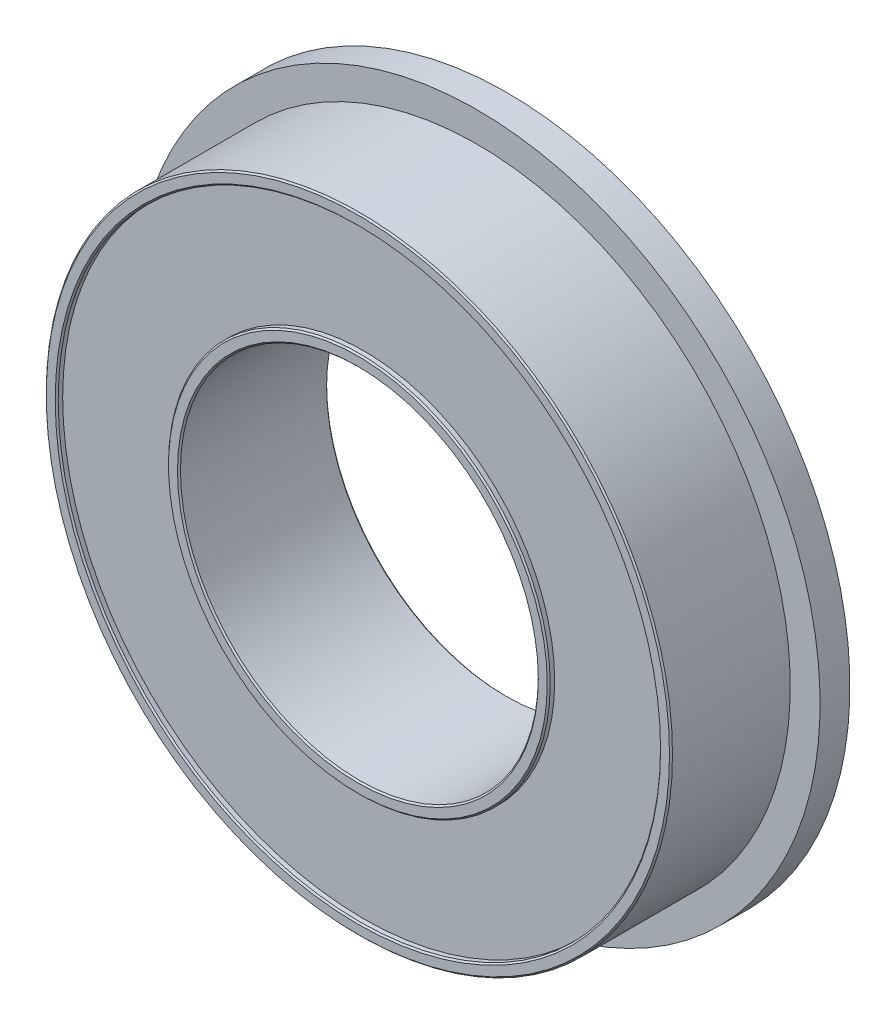
ISO-10303-21;
HEADER;
FILE_DESCRIPTION(('STEP AP214'),'2;1');
FILE_NAME('part.step','',(''),(''),'','','');
FILE_SCHEMA(('AUTOMOTIVE_DESIGN { 1 0 10303 214 1 1 1 1 }'));
ENDSEC;
DATA;
#1=APPLICATION_CONTEXT('core data for automotive mechanical design processes');
#2=APPLICATION_PROTOCOL_DEFINITION('international standard','automotive_design',2000,#1);
#3=PRODUCT_CONTEXT('',#1,'mechanical');
#4=PRODUCT('Part','Part','',(#3));
#5=PRODUCT_RELATED_PRODUCT_CATEGORY('part','',(#4));
#6=PRODUCT_DEFINITION_FORMATION('','',#4);
#7=PRODUCT_DEFINITION_CONTEXT('part definition',#1,'design');
#8=PRODUCT_DEFINITION('design','',#6,#7);
#9=PRODUCT_DEFINITION_SHAPE('','',#8);
#10=(LENGTH_UNIT() NAMED_UNIT(*) SI_UNIT(.MILLI.,.METRE.));
#11=(NAMED_UNIT(*) PLANE_ANGLE_UNIT() SI_UNIT($,.RADIAN.));
#12=(NAMED_UNIT(*) SI_UNIT($,.STERADIAN.) SOLID_ANGLE_UNIT());
#13=UNCERTAINTY_MEASURE_WITH_UNIT(LENGTH_MEASURE(1.E-05),#10,'distance_accuracy_value','');
#14=(GEOMETRIC_REPRESENTATION_CONTEXT(3) GLOBAL_UNCERTAINTY_ASSIGNED_CONTEXT((#13)) GLOBAL_UNIT_ASSIGNED_CONTEXT((#10,
#11,#12)) REPRESENTATION_CONTEXT('',''));
#15=CARTESIAN_POINT('',(0.,0.,0.));
#16=DIRECTION('',(0.,0.,1.));
#17=DIRECTION('',(1.,0.,0.));
#18=AXIS2_PLACEMENT_3D('',#15,#16,#17);
#19=CARTESIAN_POINT('',(0.,0.,-2.5));
#20=DIRECTION('',(0.,0.,1.));
#21=DIRECTION('',(1.,0.,0.));
#22=AXIS2_PLACEMENT_3D('',#19,#20,#21);
#23=PLANE('',#22);
#24=CARTESIAN_POINT('',(0.,0.,-2.5));
#25=DIRECTION('',(0.,0.,1.));
#26=DIRECTION('',(1.,0.,0.));
#27=AXIS2_PLACEMENT_3D('',#24,#25,#26);
#28=CIRCLE('',#27,10.15);
#29=CARTESIAN_POINT('',(10.15,0.,-2.5));
#30=VERTEX_POINT('',#29);
#31=EDGE_CURVE('E39',#30,#30,#28,.T.);
#32=ORIENTED_EDGE('',*,*,#31,.T.);
#33=EDGE_LOOP('',(#32));
#34=FACE_BOUND('',#33,.T.);
#35=CARTESIAN_POINT('',(0.,0.,-2.5));
#36=DIRECTION('',(0.,0.,-1.));
#37=DIRECTION('',(-1.,0.,0.));
#38=AXIS2_PLACEMENT_3D('',#35,#36,#37);
#39=CIRCLE('',#38,11.5);
#40=CARTESIAN_POINT('',(-11.5,0.,-2.5));
#41=VERTEX_POINT('',#40);
#42=EDGE_CURVE('E86',#41,#41,#39,.T.);
#43=ORIENTED_EDGE('',*,*,#42,.T.);
#44=EDGE_LOOP('',(#43));
#45=FACE_BOUND('',#44,.T.);
#46=ADVANCED_FACE('F32',(#34,#45),#23,.F.);
#47=CARTESIAN_POINT('',(0.,0.,2.5));
#48=DIRECTION('',(0.,0.,1.));
#49=DIRECTION('',(1.,0.,0.));
#50=AXIS2_PLACEMENT_3D('',#47,#48,#49);
#51=PLANE('',#50);
#52=CARTESIAN_POINT('',(0.,0.,2.5));
#53=DIRECTION('',(0.,0.,1.));
#54=DIRECTION('',(1.,0.,0.));
#55=AXIS2_PLACEMENT_3D('',#52,#53,#54);
#56=CIRCLE('',#55,6.35);
#57=CARTESIAN_POINT('',(6.35,0.,2.5));
#58=VERTEX_POINT('',#57);
#59=EDGE_CURVE('E61',#58,#58,#56,.T.);
#60=ORIENTED_EDGE('',*,*,#59,.T.);
#61=EDGE_LOOP('',(#60));
#62=FACE_BOUND('',#61,.T.);
#63=CARTESIAN_POINT('',(0.,0.,2.5));
#64=DIRECTION('',(0.,0.,1.));
#65=DIRECTION('',(1.,0.,0.));
#66=AXIS2_PLACEMENT_3D('',#63,#64,#65);
#67=CIRCLE('',#66,6.05);
#68=CARTESIAN_POINT('',(6.05,0.,2.5));
#69=VERTEX_POINT('',#68);
#70=EDGE_CURVE('E64',#69,#69,#67,.F.);
#71=ORIENTED_EDGE('',*,*,#70,.T.);
#72=EDGE_LOOP('',(#71));
#73=FACE_BOUND('',#72,.T.);
#74=ADVANCED_FACE('F122',(#62,#73),#51,.T.);
#75=CARTESIAN_POINT('',(0.,0.,2.5));
#76=DIRECTION('',(0.,0.,-1.));
#77=DIRECTION('',(-1.,0.,0.));
#78=AXIS2_PLACEMENT_3D('',#75,#76,#77);
#79=CYLINDRICAL_SURFACE('',#78,10.5);
#80=CARTESIAN_POINT('',(0.,0.,2.45));
#81=DIRECTION('',(0.,0.,1.));
#82=DIRECTION('',(1.,0.,0.));
#83=AXIS2_PLACEMENT_3D('',#80,#81,#82);
#84=CIRCLE('',#83,10.5);
#85=CARTESIAN_POINT('',(10.5,0.,2.45));
#86=VERTEX_POINT('',#85);
#87=EDGE_CURVE('E47',#86,#86,#84,.F.);
#88=ORIENTED_EDGE('',*,*,#87,.T.);
#89=EDGE_LOOP('',(#88));
#90=FACE_BOUND('',#89,.T.);
#91=CARTESIAN_POINT('',(0.,0.,-1.5));
#92=DIRECTION('',(0.,0.,-1.));
#93=DIRECTION('',(-1.,0.,0.));
#94=AXIS2_PLACEMENT_3D('',#91,#92,#93);
#95=CIRCLE('',#94,10.5);
#96=CARTESIAN_POINT('',(-10.5,0.,-1.5));
#97=VERTEX_POINT('',#96);
#98=EDGE_CURVE('E82',#97,#97,#95,.T.);
#99=ORIENTED_EDGE('',*,*,#98,.F.);
#100=EDGE_LOOP('',(#99));
#101=FACE_BOUND('',#100,.T.);
#102=ADVANCED_FACE('F128',(#90,#101),#79,.T.);
#103=CARTESIAN_POINT('',(0.,0.,2.5));
#104=DIRECTION('',(0.,0.,1.));
#105=DIRECTION('',(1.,0.,0.));
#106=AXIS2_PLACEMENT_3D('',#103,#104,#105);
#107=CIRCLE('',#106,10.45);
#108=CARTESIAN_POINT('',(10.45,0.,2.5));
#109=VERTEX_POINT('',#108);
#110=EDGE_CURVE('E52',#109,#109,#107,.T.);
#111=ORIENTED_EDGE('',*,*,#110,.T.);
#112=EDGE_LOOP('',(#111));
#113=FACE_BOUND('',#112,.T.);
#114=CARTESIAN_POINT('',(0.,0.,2.5));
#115=DIRECTION('',(0.,0.,1.));
#116=DIRECTION('',(1.,0.,0.));
#117=AXIS2_PLACEMENT_3D('',#114,#115,#116);
#118=CIRCLE('',#117,10.15);
#119=CARTESIAN_POINT('',(10.15,0.,2.5));
#120=VERTEX_POINT('',#119);
#121=EDGE_CURVE('E55',#120,#120,#118,.F.);
#122=ORIENTED_EDGE('',*,*,#121,.T.);
#123=EDGE_LOOP('',(#122));
#124=FACE_BOUND('',#123,.T.);
#125=ADVANCED_FACE('F131',(#113,#124),#51,.T.);
#126=CARTESIAN_POINT('',(0.,0.,-2.5));
#127=DIRECTION('',(0.,0.,1.));
#128=DIRECTION('',(1.,0.,0.));
#129=AXIS2_PLACEMENT_3D('',#126,#127,#128);
#130=CIRCLE('',#129,6.05);
#131=CARTESIAN_POINT('',(6.05,0.,-2.5));
#132=VERTEX_POINT('',#131);
#133=EDGE_CURVE('E76',#132,#132,#130,.T.);
#134=ORIENTED_EDGE('',*,*,#133,.T.);
#135=EDGE_LOOP('',(#134));
#136=FACE_BOUND('',#135,.T.);
#137=CARTESIAN_POINT('',(0.,0.,-2.5));
#138=DIRECTION('',(0.,0.,1.));
#139=DIRECTION('',(1.,0.,0.));
#140=AXIS2_PLACEMENT_3D('',#137,#138,#139);
#141=CIRCLE('',#140,6.35);
#142=CARTESIAN_POINT('',(6.35,0.,-2.5));
#143=VERTEX_POINT('',#142);
#144=EDGE_CURVE('E79',#143,#143,#141,.F.);
#145=ORIENTED_EDGE('',*,*,#144,.T.);
#146=EDGE_LOOP('',(#145));
#147=FACE_BOUND('',#146,.T.);
#148=ADVANCED_FACE('F124',(#136,#147),#23,.F.);
#149=CARTESIAN_POINT('',(0.,0.,2.5));
#150=DIRECTION('',(0.,0.,-1.));
#151=DIRECTION('',(-1.,0.,0.));
#152=AXIS2_PLACEMENT_3D('',#149,#150,#151);
#153=CYLINDRICAL_SURFACE('',#152,6.);
#154=CARTESIAN_POINT('',(0.,0.,-2.45));
#155=DIRECTION('',(0.,0.,1.));
#156=DIRECTION('',(1.,0.,0.));
#157=AXIS2_PLACEMENT_3D('',#154,#155,#156);
#158=CIRCLE('',#157,6.);
#159=CARTESIAN_POINT('',(6.,0.,-2.45));
#160=VERTEX_POINT('',#159);
#161=EDGE_CURVE('E70',#160,#160,#158,.F.);
#162=ORIENTED_EDGE('',*,*,#161,.T.);
#163=EDGE_LOOP('',(#162));
#164=FACE_BOUND('',#163,.T.);
#165=CARTESIAN_POINT('',(0.,0.,2.45));
#166=DIRECTION('',(0.,0.,1.));
#167=DIRECTION('',(1.,0.,0.));
#168=AXIS2_PLACEMENT_3D('',#165,#166,#167);
#169=CIRCLE('',#168,6.);
#170=CARTESIAN_POINT('',(6.,0.,2.45));
#171=VERTEX_POINT('',#170);
#172=EDGE_CURVE('E73',#171,#171,#169,.T.);
#173=ORIENTED_EDGE('',*,*,#172,.T.);
#174=EDGE_LOOP('',(#173));
#175=FACE_BOUND('',#174,.T.);
#176=ADVANCED_FACE('F135',(#164,#175),#153,.F.);
#177=CARTESIAN_POINT('',(0.,0.,-1.5));
#178=DIRECTION('',(0.,0.,-1.));
#179=DIRECTION('',(-1.,0.,0.));
#180=AXIS2_PLACEMENT_3D('',#177,#178,#179);
#181=PLANE('',#180);
#182=CARTESIAN_POINT('',(0.,0.,-1.5));
#183=DIRECTION('',(0.,0.,-1.));
#184=DIRECTION('',(-1.,0.,0.));
#185=AXIS2_PLACEMENT_3D('',#182,#183,#184);
#186=CIRCLE('',#185,11.5);
#187=CARTESIAN_POINT('',(-11.5,0.,-1.5));
#188=VERTEX_POINT('',#187);
#189=EDGE_CURVE('E85',#188,#188,#186,.T.);
#190=ORIENTED_EDGE('',*,*,#189,.F.);
#191=EDGE_LOOP('',(#190));
#192=FACE_BOUND('',#191,.T.);
#193=ORIENTED_EDGE('',*,*,#98,.T.);
#194=EDGE_LOOP('',(#193));
#195=FACE_BOUND('',#194,.T.);
#196=ADVANCED_FACE('F141',(#192,#195),#181,.F.);
#197=CARTESIAN_POINT('',(0.,0.,-1.5));
#198=DIRECTION('',(0.,0.,-1.));
#199=DIRECTION('',(-1.,0.,0.));
#200=AXIS2_PLACEMENT_3D('',#197,#198,#199);
#201=CYLINDRICAL_SURFACE('',#200,11.5);
#202=ORIENTED_EDGE('',*,*,#189,.T.);
#203=EDGE_LOOP('',(#202));
#204=FACE_BOUND('',#203,.T.);
#205=ORIENTED_EDGE('',*,*,#42,.F.);
#206=EDGE_LOOP('',(#205));
#207=FACE_BOUND('',#206,.T.);
#208=ADVANCED_FACE('F182',(#204,#207),#201,.T.);
#209=CARTESIAN_POINT('',(0.,0.,2.3));
#210=DIRECTION('',(0.,0.,1.));
#211=DIRECTION('',(1.,0.,0.));
#212=AXIS2_PLACEMENT_3D('',#209,#210,#211);
#213=CYLINDRICAL_SURFACE('',#212,10.1);
#214=CARTESIAN_POINT('',(0.,0.,2.45));
#215=DIRECTION('',(0.,0.,1.));
#216=DIRECTION('',(1.,0.,0.));
#217=AXIS2_PLACEMENT_3D('',#214,#215,#216);
#218=CIRCLE('',#217,10.1);
#219=CARTESIAN_POINT('',(10.1,0.,2.45));
#220=VERTEX_POINT('',#219);
#221=EDGE_CURVE('E43',#220,#220,#218,.T.);
#222=ORIENTED_EDGE('',*,*,#221,.T.);
#223=EDGE_LOOP('',(#222));
#224=FACE_BOUND('',#223,.T.);
#225=CARTESIAN_POINT('',(0.,0.,2.3));
#226=DIRECTION('',(0.,0.,1.));
#227=DIRECTION('',(1.,0.,0.));
#228=AXIS2_PLACEMENT_3D('',#225,#226,#227);
#229=CIRCLE('',#228,10.1);
#230=CARTESIAN_POINT('',(10.1,0.,2.3));
#231=VERTEX_POINT('',#230);
#232=EDGE_CURVE('E89',#231,#231,#229,.T.);
#233=ORIENTED_EDGE('',*,*,#232,.F.);
#234=EDGE_LOOP('',(#233));
#235=FACE_BOUND('',#234,.T.);
#236=ADVANCED_FACE('F178',(#224,#235),#213,.F.);
#237=CARTESIAN_POINT('',(0.,0.,2.3));
#238=DIRECTION('',(0.,0.,1.));
#239=DIRECTION('',(1.,0.,0.));
#240=AXIS2_PLACEMENT_3D('',#237,#238,#239);
#241=PLANE('',#240);
#242=CARTESIAN_POINT('',(0.,0.,2.3));
#243=DIRECTION('',(0.,0.,1.));
#244=DIRECTION('',(1.,0.,0.));
#245=AXIS2_PLACEMENT_3D('',#242,#243,#244);
#246=CIRCLE('',#245,6.4);
#247=CARTESIAN_POINT('',(6.4,0.,2.3));
#248=VERTEX_POINT('',#247);
#249=EDGE_CURVE('E94',#248,#248,#246,.T.);
#250=ORIENTED_EDGE('',*,*,#249,.F.);
#251=EDGE_LOOP('',(#250));
#252=FACE_BOUND('',#251,.T.);
#253=ORIENTED_EDGE('',*,*,#232,.T.);
#254=EDGE_LOOP('',(#253));
#255=FACE_BOUND('',#254,.T.);
#256=ADVANCED_FACE('F181',(#252,#255),#241,.T.);
#257=CARTESIAN_POINT('',(0.,0.,2.3));
#258=DIRECTION('',(0.,0.,1.));
#259=DIRECTION('',(1.,0.,0.));
#260=AXIS2_PLACEMENT_3D('',#257,#258,#259);
#261=CYLINDRICAL_SURFACE('',#260,6.4);
#262=CARTESIAN_POINT('',(0.,0.,2.45));
#263=DIRECTION('',(0.,0.,1.));
#264=DIRECTION('',(1.,0.,0.));
#265=AXIS2_PLACEMENT_3D('',#262,#263,#264);
#266=CIRCLE('',#265,6.4);
#267=CARTESIAN_POINT('',(6.4,0.,2.45));
#268=VERTEX_POINT('',#267);
#269=EDGE_CURVE('E58',#268,#268,#266,.F.);
#270=ORIENTED_EDGE('',*,*,#269,.T.);
#271=EDGE_LOOP('',(#270));
#272=FACE_BOUND('',#271,.T.);
#273=ORIENTED_EDGE('',*,*,#249,.T.);
#274=EDGE_LOOP('',(#273));
#275=FACE_BOUND('',#274,.T.);
#276=ADVANCED_FACE('F187',(#272,#275),#261,.T.);
#277=CARTESIAN_POINT('',(0.,0.,-2.3));
#278=DIRECTION('',(0.,0.,-1.));
#279=DIRECTION('',(1.,0.,0.));
#280=AXIS2_PLACEMENT_3D('',#277,#278,#279);
#281=PLANE('',#280);
#282=CARTESIAN_POINT('',(0.,0.,-2.3));
#283=DIRECTION('',(0.,0.,1.));
#284=DIRECTION('',(1.,0.,0.));
#285=AXIS2_PLACEMENT_3D('',#282,#283,#284);
#286=CIRCLE('',#285,10.1);
#287=CARTESIAN_POINT('',(10.1,0.,-2.3));
#288=VERTEX_POINT('',#287);
#289=EDGE_CURVE('E97',#288,#288,#286,.T.);
#290=ORIENTED_EDGE('',*,*,#289,.F.);
#291=EDGE_LOOP('',(#290));
#292=FACE_BOUND('',#291,.T.);
#293=CARTESIAN_POINT('',(0.,0.,-2.3));
#294=DIRECTION('',(0.,0.,1.));
#295=DIRECTION('',(1.,0.,0.));
#296=AXIS2_PLACEMENT_3D('',#293,#294,#295);
#297=CIRCLE('',#296,6.4);
#298=CARTESIAN_POINT('',(6.4,0.,-2.3));
#299=VERTEX_POINT('',#298);
#300=EDGE_CURVE('E100',#299,#299,#297,.T.);
#301=ORIENTED_EDGE('',*,*,#300,.T.);
#302=EDGE_LOOP('',(#301));
#303=FACE_BOUND('',#302,.T.);
#304=ADVANCED_FACE('F104',(#292,#303),#281,.T.);
#305=CARTESIAN_POINT('',(0.,0.,-2.3));
#306=DIRECTION('',(0.,0.,-1.));
#307=DIRECTION('',(-1.,0.,0.));
#308=AXIS2_PLACEMENT_3D('',#305,#306,#307);
#309=CYLINDRICAL_SURFACE('',#308,10.1);
#310=CARTESIAN_POINT('',(0.,0.,-2.45));
#311=DIRECTION('',(0.,0.,1.));
#312=DIRECTION('',(1.,0.,0.));
#313=AXIS2_PLACEMENT_3D('',#310,#311,#312);
#314=CIRCLE('',#313,10.1);
#315=CARTESIAN_POINT('',(10.1,0.,-2.45));
#316=VERTEX_POINT('',#315);
#317=EDGE_CURVE('E10',#316,#316,#314,.F.);
#318=ORIENTED_EDGE('',*,*,#317,.T.);
#319=EDGE_LOOP('',(#318));
#320=FACE_BOUND('',#319,.T.);
#321=ORIENTED_EDGE('',*,*,#289,.T.);
#322=EDGE_LOOP('',(#321));
#323=FACE_BOUND('',#322,.T.);
#324=ADVANCED_FACE('F109',(#320,#323),#309,.F.);
#325=CARTESIAN_POINT('',(0.,0.,-2.3));
#326=DIRECTION('',(0.,0.,-1.));
#327=DIRECTION('',(-1.,0.,0.));
#328=AXIS2_PLACEMENT_3D('',#325,#326,#327);
#329=CYLINDRICAL_SURFACE('',#328,6.4);
#330=CARTESIAN_POINT('',(0.,0.,-2.45));
#331=DIRECTION('',(0.,0.,1.));
#332=DIRECTION('',(1.,0.,0.));
#333=AXIS2_PLACEMENT_3D('',#330,#331,#332);
#334=CIRCLE('',#333,6.4);
#335=CARTESIAN_POINT('',(6.4,0.,-2.45));
#336=VERTEX_POINT('',#335);
#337=EDGE_CURVE('E67',#336,#336,#334,.T.);
#338=ORIENTED_EDGE('',*,*,#337,.T.);
#339=EDGE_LOOP('',(#338));
#340=FACE_BOUND('',#339,.T.);
#341=ORIENTED_EDGE('',*,*,#300,.F.);
#342=EDGE_LOOP('',(#341));
#343=FACE_BOUND('',#342,.T.);
#344=ADVANCED_FACE('F106',(#340,#343),#329,.T.);
#345=CARTESIAN_POINT('',(0.,0.,-2.5));
#346=DIRECTION('',(0.,0.,-1.));
#347=DIRECTION('',(-1.,0.,0.));
#348=AXIS2_PLACEMENT_3D('',#345,#346,#347);
#349=CONICAL_SURFACE('',#348,6.05,0.785398163397457);
#350=ORIENTED_EDGE('',*,*,#161,.F.);
#351=EDGE_LOOP('',(#350));
#352=FACE_BOUND('',#351,.T.);
#353=ORIENTED_EDGE('',*,*,#133,.F.);
#354=EDGE_LOOP('',(#353));
#355=FACE_BOUND('',#354,.T.);
#356=ADVANCED_FACE('F108',(#352,#355),#349,.F.);
#357=CARTESIAN_POINT('',(0.,0.,-2.45));
#358=DIRECTION('',(0.,0.,1.));
#359=DIRECTION('',(1.,0.,0.));
#360=AXIS2_PLACEMENT_3D('',#357,#358,#359);
#361=CONICAL_SURFACE('',#360,6.4,0.78539816339744);
#362=ORIENTED_EDGE('',*,*,#144,.F.);
#363=EDGE_LOOP('',(#362));
#364=FACE_BOUND('',#363,.T.);
#365=ORIENTED_EDGE('',*,*,#337,.F.);
#366=EDGE_LOOP('',(#365));
#367=FACE_BOUND('',#366,.T.);
#368=ADVANCED_FACE('F116',(#364,#367),#361,.T.);
#369=CARTESIAN_POINT('',(0.,0.,2.5));
#370=DIRECTION('',(0.,0.,-1.));
#371=DIRECTION('',(-1.,0.,0.));
#372=AXIS2_PLACEMENT_3D('',#369,#370,#371);
#373=CONICAL_SURFACE('',#372,6.35,0.785398163397466);
#374=ORIENTED_EDGE('',*,*,#269,.F.);
#375=EDGE_LOOP('',(#374));
#376=FACE_BOUND('',#375,.T.);
#377=ORIENTED_EDGE('',*,*,#59,.F.);
#378=EDGE_LOOP('',(#377));
#379=FACE_BOUND('',#378,.T.);
#380=ADVANCED_FACE('F151',(#376,#379),#373,.T.);
#381=CARTESIAN_POINT('',(0.,0.,2.45));
#382=DIRECTION('',(0.,0.,1.));
#383=DIRECTION('',(1.,0.,0.));
#384=AXIS2_PLACEMENT_3D('',#381,#382,#383);
#385=CONICAL_SURFACE('',#384,6.,0.785398163397431);
#386=ORIENTED_EDGE('',*,*,#70,.F.);
#387=EDGE_LOOP('',(#386));
#388=FACE_BOUND('',#387,.T.);
#389=ORIENTED_EDGE('',*,*,#172,.F.);
#390=EDGE_LOOP('',(#389));
#391=FACE_BOUND('',#390,.T.);
#392=ADVANCED_FACE('F157',(#388,#391),#385,.F.);
#393=CARTESIAN_POINT('',(0.,0.,2.5));
#394=DIRECTION('',(0.,0.,-1.));
#395=DIRECTION('',(-1.,0.,0.));
#396=AXIS2_PLACEMENT_3D('',#393,#394,#395);
#397=CONICAL_SURFACE('',#396,10.45,0.785398163397448);
#398=ORIENTED_EDGE('',*,*,#87,.F.);
#399=EDGE_LOOP('',(#398));
#400=FACE_BOUND('',#399,.T.);
#401=ORIENTED_EDGE('',*,*,#110,.F.);
#402=EDGE_LOOP('',(#401));
#403=FACE_BOUND('',#402,.T.);
#404=ADVANCED_FACE('F163',(#400,#403),#397,.T.);
#405=CARTESIAN_POINT('',(0.,0.,2.45));
#406=DIRECTION('',(0.,0.,1.));
#407=DIRECTION('',(1.,0.,0.));
#408=AXIS2_PLACEMENT_3D('',#405,#406,#407);
#409=CONICAL_SURFACE('',#408,10.1,0.785398163397414);
#410=ORIENTED_EDGE('',*,*,#121,.F.);
#411=EDGE_LOOP('',(#410));
#412=FACE_BOUND('',#411,.T.);
#413=ORIENTED_EDGE('',*,*,#221,.F.);
#414=EDGE_LOOP('',(#413));
#415=FACE_BOUND('',#414,.T.);
#416=ADVANCED_FACE('F166',(#412,#415),#409,.F.);
#417=CARTESIAN_POINT('',(0.,0.,-2.5));
#418=DIRECTION('',(0.,0.,-1.));
#419=DIRECTION('',(-1.,0.,0.));
#420=AXIS2_PLACEMENT_3D('',#417,#418,#419);
#421=CONICAL_SURFACE('',#420,10.15,0.785398163397448);
#422=ORIENTED_EDGE('',*,*,#317,.F.);
#423=EDGE_LOOP('',(#422));
#424=FACE_BOUND('',#423,.T.);
#425=ORIENTED_EDGE('',*,*,#31,.F.);
#426=EDGE_LOOP('',(#425));
#427=FACE_BOUND('',#426,.T.);
#428=ADVANCED_FACE('F34',(#424,#427),#421,.F.);
#429=CLOSED_SHELL('',(#46,#74,#102,#125,#148,#176,#196,#208,#236,#256,#276,#304,#324,#344,#356,
#368,#380,#392,#404,#416,#428));
#430=MANIFOLD_SOLID_BREP('B2',#429);
#431=ADVANCED_BREP_SHAPE_REPRESENTATION('',(#18,#430),#14);
#432=SHAPE_DEFINITION_REPRESENTATION(#9,#431);
ENDSEC;
END-ISO-10303-21;
